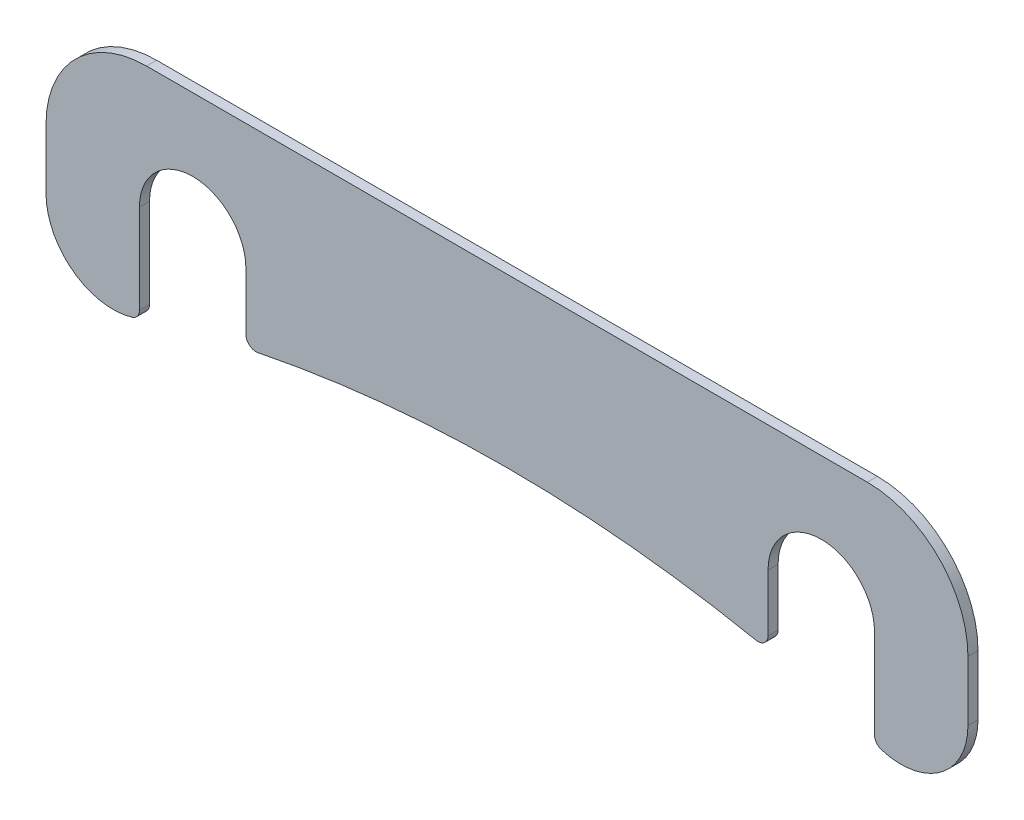
ISO-10303-21;
HEADER;
FILE_DESCRIPTION(('STEP AP214'),'2;1');
FILE_NAME('part.step','',(''),(''),'','','');
FILE_SCHEMA(('AUTOMOTIVE_DESIGN { 1 0 10303 214 1 1 1 1 }'));
ENDSEC;
DATA;
#1=APPLICATION_CONTEXT('core data for automotive mechanical design processes');
#2=APPLICATION_PROTOCOL_DEFINITION('international standard','automotive_design',2000,#1);
#3=PRODUCT_CONTEXT('',#1,'mechanical');
#4=PRODUCT('Part','Part','',(#3));
#5=PRODUCT_RELATED_PRODUCT_CATEGORY('part','',(#4));
#6=PRODUCT_DEFINITION_FORMATION('','',#4);
#7=PRODUCT_DEFINITION_CONTEXT('part definition',#1,'design');
#8=PRODUCT_DEFINITION('design','',#6,#7);
#9=PRODUCT_DEFINITION_SHAPE('','',#8);
#10=(LENGTH_UNIT() NAMED_UNIT(*) SI_UNIT(.MILLI.,.METRE.));
#11=(NAMED_UNIT(*) PLANE_ANGLE_UNIT() SI_UNIT($,.RADIAN.));
#12=(NAMED_UNIT(*) SI_UNIT($,.STERADIAN.) SOLID_ANGLE_UNIT());
#13=UNCERTAINTY_MEASURE_WITH_UNIT(LENGTH_MEASURE(1.E-05),#10,'distance_accuracy_value','');
#14=(GEOMETRIC_REPRESENTATION_CONTEXT(3) GLOBAL_UNCERTAINTY_ASSIGNED_CONTEXT((#13)) GLOBAL_UNIT_ASSIGNED_CONTEXT((#10,
#11,#12)) REPRESENTATION_CONTEXT('',''));
#15=CARTESIAN_POINT('',(0.,0.,0.));
#16=DIRECTION('',(0.,0.,1.));
#17=DIRECTION('',(1.,0.,0.));
#18=AXIS2_PLACEMENT_3D('',#15,#16,#17);
#19=CARTESIAN_POINT('',(-23.8125,0.,0.762));
#20=DIRECTION('',(0.,0.,-1.));
#21=DIRECTION('',(-1.,0.,0.));
#22=AXIS2_PLACEMENT_3D('',#19,#20,#21);
#23=CYLINDRICAL_SURFACE('',#22,4.03225);
#24=CARTESIAN_POINT('',(-23.8125,0.,0.));
#25=DIRECTION('',(0.,0.,-1.));
#26=DIRECTION('',(1.,0.,0.));
#27=AXIS2_PLACEMENT_3D('',#24,#25,#26);
#28=CIRCLE('',#27,4.03225);
#29=CARTESIAN_POINT('',(-27.84475,0.,0.));
#30=VERTEX_POINT('',#29);
#31=CARTESIAN_POINT('',(-19.78025,0.,0.));
#32=VERTEX_POINT('',#31);
#33=EDGE_CURVE('E199',#30,#32,#28,.T.);
#34=ORIENTED_EDGE('',*,*,#33,.T.);
#35=DIRECTION('',(0.,0.,-1.));
#36=VECTOR('',#35,1.);
#37=CARTESIAN_POINT('',(-19.78025,0.,0.762));
#38=LINE('',#37,#36);
#39=CARTESIAN_POINT('',(-19.78025,0.,0.762));
#40=VERTEX_POINT('',#39);
#41=EDGE_CURVE('E178',#40,#32,#38,.T.);
#42=ORIENTED_EDGE('',*,*,#41,.F.);
#43=CARTESIAN_POINT('',(-23.8125,0.,0.762));
#44=DIRECTION('',(0.,0.,-1.));
#45=DIRECTION('',(1.,0.,0.));
#46=AXIS2_PLACEMENT_3D('',#43,#44,#45);
#47=CIRCLE('',#46,4.03225);
#48=CARTESIAN_POINT('',(-27.84475,0.,0.762));
#49=VERTEX_POINT('',#48);
#50=EDGE_CURVE('E189',#49,#40,#47,.T.);
#51=ORIENTED_EDGE('',*,*,#50,.F.);
#52=DIRECTION('',(0.,0.,-1.));
#53=VECTOR('',#52,1.);
#54=CARTESIAN_POINT('',(-27.84475,0.,0.762));
#55=LINE('',#54,#53);
#56=EDGE_CURVE('E277',#49,#30,#55,.T.);
#57=ORIENTED_EDGE('',*,*,#56,.T.);
#58=EDGE_LOOP('',(#34,#42,#51,#57));
#59=FACE_BOUND('',#58,.T.);
#60=ADVANCED_FACE('F47',(#59),#23,.F.);
#61=CARTESIAN_POINT('',(-19.78025,0.,0.762));
#62=DIRECTION('',(1.,0.,0.));
#63=DIRECTION('',(0.,0.,-1.));
#64=AXIS2_PLACEMENT_3D('',#61,#62,#63);
#65=PLANE('',#64);
#66=DIRECTION('',(0.,-1.,0.));
#67=VECTOR('',#66,1.);
#68=CARTESIAN_POINT('',(-19.78025,0.,0.));
#69=LINE('',#68,#67);
#70=CARTESIAN_POINT('',(-19.78025,-4.31543454070411,0.));
#71=VERTEX_POINT('',#70);
#72=EDGE_CURVE('E359',#32,#71,#69,.T.);
#73=ORIENTED_EDGE('',*,*,#72,.T.);
#74=DIRECTION('',(0.,0.,-1.));
#75=VECTOR('',#74,1.);
#76=CARTESIAN_POINT('',(-19.78025,-4.31543454070411,0.762));
#77=LINE('',#76,#75);
#78=CARTESIAN_POINT('',(-19.78025,-4.31543454070411,0.762));
#79=VERTEX_POINT('',#78);
#80=EDGE_CURVE('E181',#71,#79,#77,.F.);
#81=ORIENTED_EDGE('',*,*,#80,.T.);
#82=DIRECTION('',(0.,-1.,0.));
#83=VECTOR('',#82,1.);
#84=CARTESIAN_POINT('',(-19.78025,0.,0.762));
#85=LINE('',#84,#83);
#86=EDGE_CURVE('E173',#40,#79,#85,.T.);
#87=ORIENTED_EDGE('',*,*,#86,.F.);
#88=ORIENTED_EDGE('',*,*,#41,.T.);
#89=EDGE_LOOP('',(#73,#81,#87,#88));
#90=FACE_BOUND('',#89,.T.);
#91=ADVANCED_FACE('F180',(#90),#65,.F.);
#92=CARTESIAN_POINT('',(0.,-98.425,0.762));
#93=DIRECTION('',(0.,0.,-1.));
#94=DIRECTION('',(-1.,0.,0.));
#95=AXIS2_PLACEMENT_3D('',#92,#93,#94);
#96=CYLINDRICAL_SURFACE('',#95,95.25);
#97=CARTESIAN_POINT('',(0.,-98.425,0.));
#98=DIRECTION('',(0.,0.,-1.));
#99=DIRECTION('',(1.,0.,0.));
#100=AXIS2_PLACEMENT_3D('',#97,#98,#99);
#101=CIRCLE('',#100,95.25);
#102=CARTESIAN_POINT('',(-18.8673115079365,-5.06233585387311,0.));
#103=VERTEX_POINT('',#102);
#104=CARTESIAN_POINT('',(18.8673115079365,-5.06233585387311,0.));
#105=VERTEX_POINT('',#104);
#106=EDGE_CURVE('E363',#103,#105,#101,.T.);
#107=ORIENTED_EDGE('',*,*,#106,.T.);
#108=DIRECTION('',(0.,0.,-1.));
#109=VECTOR('',#108,1.);
#110=CARTESIAN_POINT('',(18.8673115079365,-5.06233585387311,0.762));
#111=LINE('',#110,#109);
#112=CARTESIAN_POINT('',(18.8673115079365,-5.06233585387311,0.762));
#113=VERTEX_POINT('',#112);
#114=EDGE_CURVE('E247',#105,#113,#111,.F.);
#115=ORIENTED_EDGE('',*,*,#114,.T.);
#116=CARTESIAN_POINT('',(0.,-98.425,0.762));
#117=DIRECTION('',(0.,0.,-1.));
#118=DIRECTION('',(1.,0.,0.));
#119=AXIS2_PLACEMENT_3D('',#116,#117,#118);
#120=CIRCLE('',#119,95.25);
#121=CARTESIAN_POINT('',(-18.8673115079365,-5.06233585387311,0.762));
#122=VERTEX_POINT('',#121);
#123=EDGE_CURVE('E187',#122,#113,#120,.T.);
#124=ORIENTED_EDGE('',*,*,#123,.F.);
#125=DIRECTION('',(0.,0.,-1.));
#126=VECTOR('',#125,1.);
#127=CARTESIAN_POINT('',(-18.8673115079365,-5.06233585387311,0.762));
#128=LINE('',#127,#126);
#129=EDGE_CURVE('E248',#122,#103,#128,.T.);
#130=ORIENTED_EDGE('',*,*,#129,.T.);
#131=EDGE_LOOP('',(#107,#115,#124,#130));
#132=FACE_BOUND('',#131,.T.);
#133=ADVANCED_FACE('F433',(#132),#96,.F.);
#134=CARTESIAN_POINT('',(19.78025,0.,0.762));
#135=DIRECTION('',(-1.,0.,0.));
#136=DIRECTION('',(0.,-1.,0.));
#137=AXIS2_PLACEMENT_3D('',#134,#135,#136);
#138=PLANE('',#137);
#139=DIRECTION('',(0.,1.,0.));
#140=VECTOR('',#139,1.);
#141=CARTESIAN_POINT('',(19.78025,0.,0.762));
#142=LINE('',#141,#140);
#143=CARTESIAN_POINT('',(19.78025,-4.31543454070413,0.762));
#144=VERTEX_POINT('',#143);
#145=CARTESIAN_POINT('',(19.78025,0.,0.762));
#146=VERTEX_POINT('',#145);
#147=EDGE_CURVE('E372',#144,#146,#142,.T.);
#148=ORIENTED_EDGE('',*,*,#147,.F.);
#149=DIRECTION('',(0.,0.,-1.));
#150=VECTOR('',#149,1.);
#151=CARTESIAN_POINT('',(19.78025,-4.31543454070413,0.762));
#152=LINE('',#151,#150);
#153=CARTESIAN_POINT('',(19.78025,-4.31543454070413,0.));
#154=VERTEX_POINT('',#153);
#155=EDGE_CURVE('E244',#144,#154,#152,.T.);
#156=ORIENTED_EDGE('',*,*,#155,.T.);
#157=DIRECTION('',(0.,1.,0.));
#158=VECTOR('',#157,1.);
#159=CARTESIAN_POINT('',(19.78025,0.,0.));
#160=LINE('',#159,#158);
#161=CARTESIAN_POINT('',(19.78025,0.,0.));
#162=VERTEX_POINT('',#161);
#163=EDGE_CURVE('E323',#154,#162,#160,.T.);
#164=ORIENTED_EDGE('',*,*,#163,.T.);
#165=DIRECTION('',(0.,0.,-1.));
#166=VECTOR('',#165,1.);
#167=CARTESIAN_POINT('',(19.78025,0.,0.762));
#168=LINE('',#167,#166);
#169=EDGE_CURVE('E201',#146,#162,#168,.T.);
#170=ORIENTED_EDGE('',*,*,#169,.F.);
#171=EDGE_LOOP('',(#148,#156,#164,#170));
#172=FACE_BOUND('',#171,.T.);
#173=ADVANCED_FACE('F369',(#172),#138,.F.);
#174=CARTESIAN_POINT('',(23.8125,0.,0.762));
#175=DIRECTION('',(0.,0.,-1.));
#176=DIRECTION('',(-1.,0.,0.));
#177=AXIS2_PLACEMENT_3D('',#174,#175,#176);
#178=CYLINDRICAL_SURFACE('',#177,4.03225);
#179=CARTESIAN_POINT('',(23.8125,0.,0.));
#180=DIRECTION('',(0.,0.,-1.));
#181=DIRECTION('',(1.,0.,0.));
#182=AXIS2_PLACEMENT_3D('',#179,#180,#181);
#183=CIRCLE('',#182,4.03225);
#184=CARTESIAN_POINT('',(27.84475,0.,0.));
#185=VERTEX_POINT('',#184);
#186=EDGE_CURVE('E312',#162,#185,#183,.T.);
#187=ORIENTED_EDGE('',*,*,#186,.T.);
#188=DIRECTION('',(0.,0.,-1.));
#189=VECTOR('',#188,1.);
#190=CARTESIAN_POINT('',(27.84475,0.,0.762));
#191=LINE('',#190,#189);
#192=CARTESIAN_POINT('',(27.84475,0.,0.762));
#193=VERTEX_POINT('',#192);
#194=EDGE_CURVE('E213',#193,#185,#191,.T.);
#195=ORIENTED_EDGE('',*,*,#194,.F.);
#196=CARTESIAN_POINT('',(23.8125,0.,0.762));
#197=DIRECTION('',(0.,0.,-1.));
#198=DIRECTION('',(1.,0.,0.));
#199=AXIS2_PLACEMENT_3D('',#196,#197,#198);
#200=CIRCLE('',#199,4.03225);
#201=EDGE_CURVE('E375',#146,#193,#200,.T.);
#202=ORIENTED_EDGE('',*,*,#201,.F.);
#203=ORIENTED_EDGE('',*,*,#169,.T.);
#204=EDGE_LOOP('',(#187,#195,#202,#203));
#205=FACE_BOUND('',#204,.T.);
#206=ADVANCED_FACE('F371',(#205),#178,.F.);
#207=CARTESIAN_POINT('',(27.84475,0.,0.762));
#208=DIRECTION('',(1.,0.,0.));
#209=DIRECTION('',(0.,1.,0.));
#210=AXIS2_PLACEMENT_3D('',#207,#208,#209);
#211=PLANE('',#210);
#212=DIRECTION('',(0.,-1.,0.));
#213=VECTOR('',#212,1.);
#214=CARTESIAN_POINT('',(27.84475,0.,0.));
#215=LINE('',#214,#213);
#216=CARTESIAN_POINT('',(27.84475,-6.77341920168427,0.));
#217=VERTEX_POINT('',#216);
#218=EDGE_CURVE('E306',#185,#217,#215,.T.);
#219=ORIENTED_EDGE('',*,*,#218,.T.);
#220=DIRECTION('',(0.,0.,-1.));
#221=VECTOR('',#220,1.);
#222=CARTESIAN_POINT('',(27.84475,-6.77341920168427,0.762));
#223=LINE('',#222,#221);
#224=CARTESIAN_POINT('',(27.84475,-6.77341920168427,0.762));
#225=VERTEX_POINT('',#224);
#226=EDGE_CURVE('E230',#217,#225,#223,.F.);
#227=ORIENTED_EDGE('',*,*,#226,.T.);
#228=DIRECTION('',(0.,-1.,0.));
#229=VECTOR('',#228,1.);
#230=CARTESIAN_POINT('',(27.84475,0.,0.762));
#231=LINE('',#230,#229);
#232=EDGE_CURVE('E309',#193,#225,#231,.T.);
#233=ORIENTED_EDGE('',*,*,#232,.F.);
#234=ORIENTED_EDGE('',*,*,#194,.T.);
#235=EDGE_LOOP('',(#219,#227,#233,#234));
#236=FACE_BOUND('',#235,.T.);
#237=ADVANCED_FACE('F307',(#236),#211,.F.);
#238=CARTESIAN_POINT('',(29.845,-2.63677068658174,0.762));
#239=DIRECTION('',(0.,0.,-1.));
#240=DIRECTION('',(-1.,0.,0.));
#241=AXIS2_PLACEMENT_3D('',#238,#239,#240);
#242=CYLINDRICAL_SURFACE('',#241,5.08);
#243=CARTESIAN_POINT('',(29.845,-2.63677068658174,0.762));
#244=DIRECTION('',(0.,0.,1.));
#245=DIRECTION('',(1.,0.,0.));
#246=AXIS2_PLACEMENT_3D('',#243,#244,#245);
#247=CIRCLE('',#246,5.08);
#248=CARTESIAN_POINT('',(28.3882352941176,-7.50341599846707,0.762));
#249=VERTEX_POINT('',#248);
#250=CARTESIAN_POINT('',(34.925,-2.63677068658174,0.762));
#251=VERTEX_POINT('',#250);
#252=EDGE_CURVE('E376',#249,#251,#247,.T.);
#253=ORIENTED_EDGE('',*,*,#252,.F.);
#254=DIRECTION('',(0.,0.,-1.));
#255=VECTOR('',#254,1.);
#256=CARTESIAN_POINT('',(28.3882352941176,-7.50341599846707,0.762));
#257=LINE('',#256,#255);
#258=CARTESIAN_POINT('',(28.3882352941176,-7.50341599846707,0.));
#259=VERTEX_POINT('',#258);
#260=EDGE_CURVE('E205',#249,#259,#257,.T.);
#261=ORIENTED_EDGE('',*,*,#260,.T.);
#262=CARTESIAN_POINT('',(29.845,-2.63677068658174,0.));
#263=DIRECTION('',(0.,0.,1.));
#264=DIRECTION('',(1.,0.,0.));
#265=AXIS2_PLACEMENT_3D('',#262,#263,#264);
#266=CIRCLE('',#265,5.08);
#267=CARTESIAN_POINT('',(34.925,-2.63677068658174,0.));
#268=VERTEX_POINT('',#267);
#269=EDGE_CURVE('E320',#259,#268,#266,.T.);
#270=ORIENTED_EDGE('',*,*,#269,.T.);
#271=DIRECTION('',(0.,0.,-1.));
#272=VECTOR('',#271,1.);
#273=CARTESIAN_POINT('',(34.925,-2.63677068658174,0.762));
#274=LINE('',#273,#272);
#275=EDGE_CURVE('E297',#251,#268,#274,.T.);
#276=ORIENTED_EDGE('',*,*,#275,.F.);
#277=EDGE_LOOP('',(#253,#261,#270,#276));
#278=FACE_BOUND('',#277,.T.);
#279=ADVANCED_FACE('F415',(#278),#242,.T.);
#280=CARTESIAN_POINT('',(34.925,1.90499999999995,0.762));
#281=DIRECTION('',(-1.,0.,0.));
#282=DIRECTION('',(0.,0.,1.));
#283=AXIS2_PLACEMENT_3D('',#280,#281,#282);
#284=PLANE('',#283);
#285=DIRECTION('',(0.,1.,0.));
#286=VECTOR('',#285,1.);
#287=CARTESIAN_POINT('',(34.925,1.90499999999995,0.));
#288=LINE('',#287,#286);
#289=CARTESIAN_POINT('',(34.925,1.90499999999995,0.));
#290=VERTEX_POINT('',#289);
#291=EDGE_CURVE('E319',#268,#290,#288,.T.);
#292=ORIENTED_EDGE('',*,*,#291,.T.);
#293=DIRECTION('',(0.,0.,-1.));
#294=VECTOR('',#293,1.);
#295=CARTESIAN_POINT('',(34.925,1.90499999999995,0.762));
#296=LINE('',#295,#294);
#297=CARTESIAN_POINT('',(34.925,1.90499999999995,0.762));
#298=VERTEX_POINT('',#297);
#299=EDGE_CURVE('E291',#298,#290,#296,.T.);
#300=ORIENTED_EDGE('',*,*,#299,.F.);
#301=DIRECTION('',(0.,1.,0.));
#302=VECTOR('',#301,1.);
#303=CARTESIAN_POINT('',(34.925,1.90499999999995,0.762));
#304=LINE('',#303,#302);
#305=EDGE_CURVE('E382',#251,#298,#304,.T.);
#306=ORIENTED_EDGE('',*,*,#305,.F.);
#307=ORIENTED_EDGE('',*,*,#275,.T.);
#308=EDGE_LOOP('',(#292,#300,#306,#307));
#309=FACE_BOUND('',#308,.T.);
#310=ADVANCED_FACE('F410',(#309),#284,.F.);
#311=CARTESIAN_POINT('',(27.305,1.905,0.762));
#312=DIRECTION('',(0.,0.,-1.));
#313=DIRECTION('',(-1.,0.,0.));
#314=AXIS2_PLACEMENT_3D('',#311,#312,#313);
#315=CYLINDRICAL_SURFACE('',#314,7.62);
#316=CARTESIAN_POINT('',(27.305,1.905,0.));
#317=DIRECTION('',(0.,0.,1.));
#318=DIRECTION('',(-1.,0.,0.));
#319=AXIS2_PLACEMENT_3D('',#316,#317,#318);
#320=CIRCLE('',#319,7.62);
#321=CARTESIAN_POINT('',(27.3049999999999,9.525,0.));
#322=VERTEX_POINT('',#321);
#323=EDGE_CURVE('E328',#290,#322,#320,.T.);
#324=ORIENTED_EDGE('',*,*,#323,.T.);
#325=DIRECTION('',(0.,0.,-1.));
#326=VECTOR('',#325,1.);
#327=CARTESIAN_POINT('',(27.3049999999999,9.525,0.762));
#328=LINE('',#327,#326);
#329=CARTESIAN_POINT('',(27.3049999999999,9.525,0.762));
#330=VERTEX_POINT('',#329);
#331=EDGE_CURVE('E286',#330,#322,#328,.T.);
#332=ORIENTED_EDGE('',*,*,#331,.F.);
#333=CARTESIAN_POINT('',(27.305,1.905,0.762));
#334=DIRECTION('',(0.,0.,1.));
#335=DIRECTION('',(-1.,0.,0.));
#336=AXIS2_PLACEMENT_3D('',#333,#334,#335);
#337=CIRCLE('',#336,7.62);
#338=EDGE_CURVE('E387',#298,#330,#337,.T.);
#339=ORIENTED_EDGE('',*,*,#338,.F.);
#340=ORIENTED_EDGE('',*,*,#299,.T.);
#341=EDGE_LOOP('',(#324,#332,#339,#340));
#342=FACE_BOUND('',#341,.T.);
#343=ADVANCED_FACE('F404',(#342),#315,.T.);
#344=CARTESIAN_POINT('',(-27.3049999999999,9.525,0.762));
#345=DIRECTION('',(0.,-1.,0.));
#346=DIRECTION('',(0.,0.,-1.));
#347=AXIS2_PLACEMENT_3D('',#344,#345,#346);
#348=PLANE('',#347);
#349=DIRECTION('',(-1.,0.,0.));
#350=VECTOR('',#349,1.);
#351=CARTESIAN_POINT('',(-27.3049999999999,9.525,0.));
#352=LINE('',#351,#350);
#353=CARTESIAN_POINT('',(-27.3049999999999,9.525,0.));
#354=VERTEX_POINT('',#353);
#355=EDGE_CURVE('E335',#322,#354,#352,.T.);
#356=ORIENTED_EDGE('',*,*,#355,.T.);
#357=DIRECTION('',(0.,0.,-1.));
#358=VECTOR('',#357,1.);
#359=CARTESIAN_POINT('',(-27.3049999999999,9.525,0.762));
#360=LINE('',#359,#358);
#361=CARTESIAN_POINT('',(-27.3049999999999,9.525,0.762));
#362=VERTEX_POINT('',#361);
#363=EDGE_CURVE('E283',#362,#354,#360,.T.);
#364=ORIENTED_EDGE('',*,*,#363,.F.);
#365=DIRECTION('',(-1.,0.,0.));
#366=VECTOR('',#365,1.);
#367=CARTESIAN_POINT('',(-27.3049999999999,9.525,0.762));
#368=LINE('',#367,#366);
#369=EDGE_CURVE('E389',#330,#362,#368,.T.);
#370=ORIENTED_EDGE('',*,*,#369,.F.);
#371=ORIENTED_EDGE('',*,*,#331,.T.);
#372=EDGE_LOOP('',(#356,#364,#370,#371));
#373=FACE_BOUND('',#372,.T.);
#374=ADVANCED_FACE('F398',(#373),#348,.F.);
#375=CARTESIAN_POINT('',(-27.305,1.905,0.762));
#376=DIRECTION('',(0.,0.,-1.));
#377=DIRECTION('',(-1.,0.,0.));
#378=AXIS2_PLACEMENT_3D('',#375,#376,#377);
#379=CYLINDRICAL_SURFACE('',#378,7.62);
#380=CARTESIAN_POINT('',(-27.305,1.905,0.));
#381=DIRECTION('',(0.,0.,1.));
#382=DIRECTION('',(1.,0.,0.));
#383=AXIS2_PLACEMENT_3D('',#380,#381,#382);
#384=CIRCLE('',#383,7.62);
#385=CARTESIAN_POINT('',(-34.925,1.90499999999995,0.));
#386=VERTEX_POINT('',#385);
#387=EDGE_CURVE('E333',#354,#386,#384,.T.);
#388=ORIENTED_EDGE('',*,*,#387,.T.);
#389=DIRECTION('',(0.,0.,-1.));
#390=VECTOR('',#389,1.);
#391=CARTESIAN_POINT('',(-34.925,1.90499999999995,0.762));
#392=LINE('',#391,#390);
#393=CARTESIAN_POINT('',(-34.925,1.90499999999995,0.762));
#394=VERTEX_POINT('',#393);
#395=EDGE_CURVE('E282',#394,#386,#392,.T.);
#396=ORIENTED_EDGE('',*,*,#395,.F.);
#397=CARTESIAN_POINT('',(-27.305,1.905,0.762));
#398=DIRECTION('',(0.,0.,1.));
#399=DIRECTION('',(1.,0.,0.));
#400=AXIS2_PLACEMENT_3D('',#397,#398,#399);
#401=CIRCLE('',#400,7.62);
#402=EDGE_CURVE('E351',#362,#394,#401,.T.);
#403=ORIENTED_EDGE('',*,*,#402,.F.);
#404=ORIENTED_EDGE('',*,*,#363,.T.);
#405=EDGE_LOOP('',(#388,#396,#403,#404));
#406=FACE_BOUND('',#405,.T.);
#407=ADVANCED_FACE('F393',(#406),#379,.T.);
#408=CARTESIAN_POINT('',(-34.925,1.90499999999995,0.762));
#409=DIRECTION('',(1.,0.,0.));
#410=DIRECTION('',(0.,0.,-1.));
#411=AXIS2_PLACEMENT_3D('',#408,#409,#410);
#412=PLANE('',#411);
#413=DIRECTION('',(0.,-1.,0.));
#414=VECTOR('',#413,1.);
#415=CARTESIAN_POINT('',(-34.925,1.90499999999995,0.));
#416=LINE('',#415,#414);
#417=CARTESIAN_POINT('',(-34.925,-2.63677068658174,0.));
#418=VERTEX_POINT('',#417);
#419=EDGE_CURVE('E275',#386,#418,#416,.T.);
#420=ORIENTED_EDGE('',*,*,#419,.T.);
#421=DIRECTION('',(0.,0.,-1.));
#422=VECTOR('',#421,1.);
#423=CARTESIAN_POINT('',(-34.925,-2.63677068658174,0.762));
#424=LINE('',#423,#422);
#425=CARTESIAN_POINT('',(-34.925,-2.63677068658174,0.762));
#426=VERTEX_POINT('',#425);
#427=EDGE_CURVE('E279',#426,#418,#424,.T.);
#428=ORIENTED_EDGE('',*,*,#427,.F.);
#429=DIRECTION('',(0.,-1.,0.));
#430=VECTOR('',#429,1.);
#431=CARTESIAN_POINT('',(-34.925,1.90499999999995,0.762));
#432=LINE('',#431,#430);
#433=EDGE_CURVE('E346',#394,#426,#432,.T.);
#434=ORIENTED_EDGE('',*,*,#433,.F.);
#435=ORIENTED_EDGE('',*,*,#395,.T.);
#436=EDGE_LOOP('',(#420,#428,#434,#435));
#437=FACE_BOUND('',#436,.T.);
#438=ADVANCED_FACE('F342',(#437),#412,.F.);
#439=CARTESIAN_POINT('',(-29.845,-2.63677068658174,0.762));
#440=DIRECTION('',(0.,0.,-1.));
#441=DIRECTION('',(-1.,0.,0.));
#442=AXIS2_PLACEMENT_3D('',#439,#440,#441);
#443=CYLINDRICAL_SURFACE('',#442,5.08);
#444=CARTESIAN_POINT('',(-29.845,-2.63677068658174,0.));
#445=DIRECTION('',(0.,0.,1.));
#446=DIRECTION('',(1.,0.,0.));
#447=AXIS2_PLACEMENT_3D('',#444,#445,#446);
#448=CIRCLE('',#447,5.08);
#449=CARTESIAN_POINT('',(-28.3882352941176,-7.50341599846708,0.));
#450=VERTEX_POINT('',#449);
#451=EDGE_CURVE('E270',#418,#450,#448,.T.);
#452=ORIENTED_EDGE('',*,*,#451,.T.);
#453=DIRECTION('',(0.,0.,-1.));
#454=VECTOR('',#453,1.);
#455=CARTESIAN_POINT('',(-28.3882352941176,-7.50341599846708,0.762));
#456=LINE('',#455,#454);
#457=CARTESIAN_POINT('',(-28.3882352941176,-7.50341599846708,0.762));
#458=VERTEX_POINT('',#457);
#459=EDGE_CURVE('E11',#450,#458,#456,.F.);
#460=ORIENTED_EDGE('',*,*,#459,.T.);
#461=CARTESIAN_POINT('',(-29.845,-2.63677068658174,0.762));
#462=DIRECTION('',(0.,0.,1.));
#463=DIRECTION('',(1.,0.,0.));
#464=AXIS2_PLACEMENT_3D('',#461,#462,#463);
#465=CIRCLE('',#464,5.08);
#466=EDGE_CURVE('E347',#426,#458,#465,.T.);
#467=ORIENTED_EDGE('',*,*,#466,.F.);
#468=ORIENTED_EDGE('',*,*,#427,.T.);
#469=EDGE_LOOP('',(#452,#460,#467,#468));
#470=FACE_BOUND('',#469,.T.);
#471=ADVANCED_FACE('F343',(#470),#443,.T.);
#472=CARTESIAN_POINT('',(-27.84475,0.,0.762));
#473=DIRECTION('',(-1.,0.,0.));
#474=DIRECTION('',(0.,0.,1.));
#475=AXIS2_PLACEMENT_3D('',#472,#473,#474);
#476=PLANE('',#475);
#477=DIRECTION('',(0.,1.,0.));
#478=VECTOR('',#477,1.);
#479=CARTESIAN_POINT('',(-27.84475,0.,0.762));
#480=LINE('',#479,#478);
#481=CARTESIAN_POINT('',(-27.84475,-6.77341920168427,0.762));
#482=VERTEX_POINT('',#481);
#483=EDGE_CURVE('E195',#482,#49,#480,.T.);
#484=ORIENTED_EDGE('',*,*,#483,.F.);
#485=DIRECTION('',(0.,0.,-1.));
#486=VECTOR('',#485,1.);
#487=CARTESIAN_POINT('',(-27.84475,-6.77341920168427,0.762));
#488=LINE('',#487,#486);
#489=CARTESIAN_POINT('',(-27.84475,-6.77341920168427,0.));
#490=VERTEX_POINT('',#489);
#491=EDGE_CURVE('E59',#482,#490,#488,.T.);
#492=ORIENTED_EDGE('',*,*,#491,.T.);
#493=DIRECTION('',(0.,1.,0.));
#494=VECTOR('',#493,1.);
#495=CARTESIAN_POINT('',(-27.84475,0.,0.));
#496=LINE('',#495,#494);
#497=EDGE_CURVE('E197',#490,#30,#496,.T.);
#498=ORIENTED_EDGE('',*,*,#497,.T.);
#499=ORIENTED_EDGE('',*,*,#56,.F.);
#500=EDGE_LOOP('',(#484,#492,#498,#499));
#501=FACE_BOUND('',#500,.T.);
#502=ADVANCED_FACE('F257',(#501),#476,.F.);
#503=CARTESIAN_POINT('',(-23.8125,0.,0.762));
#504=DIRECTION('',(0.,0.,1.));
#505=DIRECTION('',(1.,0.,0.));
#506=AXIS2_PLACEMENT_3D('',#503,#504,#505);
#507=PLANE('',#506);
#508=ORIENTED_EDGE('',*,*,#232,.T.);
#509=CARTESIAN_POINT('',(28.60675,-6.77341920168427,0.762));
#510=DIRECTION('',(0.,0.,1.));
#511=DIRECTION('',(1.,0.,0.));
#512=AXIS2_PLACEMENT_3D('',#509,#510,#511);
#513=CIRCLE('',#512,0.762);
#514=EDGE_CURVE('E239',#225,#249,#513,.T.);
#515=ORIENTED_EDGE('',*,*,#514,.T.);
#516=ORIENTED_EDGE('',*,*,#252,.T.);
#517=ORIENTED_EDGE('',*,*,#305,.T.);
#518=ORIENTED_EDGE('',*,*,#338,.T.);
#519=ORIENTED_EDGE('',*,*,#369,.T.);
#520=ORIENTED_EDGE('',*,*,#402,.T.);
#521=ORIENTED_EDGE('',*,*,#433,.T.);
#522=ORIENTED_EDGE('',*,*,#466,.T.);
#523=CARTESIAN_POINT('',(-28.60675,-6.77341920168427,0.762));
#524=DIRECTION('',(0.,0.,1.));
#525=DIRECTION('',(1.,0.,0.));
#526=AXIS2_PLACEMENT_3D('',#523,#524,#525);
#527=CIRCLE('',#526,0.762);
#528=EDGE_CURVE('E63',#458,#482,#527,.T.);
#529=ORIENTED_EDGE('',*,*,#528,.T.);
#530=ORIENTED_EDGE('',*,*,#483,.T.);
#531=ORIENTED_EDGE('',*,*,#50,.T.);
#532=ORIENTED_EDGE('',*,*,#86,.T.);
#533=CARTESIAN_POINT('',(-19.01825,-4.31543454070411,0.762));
#534=DIRECTION('',(0.,0.,1.));
#535=DIRECTION('',(1.,0.,0.));
#536=AXIS2_PLACEMENT_3D('',#533,#534,#535);
#537=CIRCLE('',#536,0.762);
#538=EDGE_CURVE('E235',#79,#122,#537,.T.);
#539=ORIENTED_EDGE('',*,*,#538,.T.);
#540=ORIENTED_EDGE('',*,*,#123,.T.);
#541=CARTESIAN_POINT('',(19.01825,-4.31543454070413,0.762));
#542=DIRECTION('',(0.,0.,1.));
#543=DIRECTION('',(1.,0.,0.));
#544=AXIS2_PLACEMENT_3D('',#541,#542,#543);
#545=CIRCLE('',#544,0.762);
#546=EDGE_CURVE('E237',#113,#144,#545,.T.);
#547=ORIENTED_EDGE('',*,*,#546,.T.);
#548=ORIENTED_EDGE('',*,*,#147,.T.);
#549=ORIENTED_EDGE('',*,*,#201,.T.);
#550=EDGE_LOOP('',(#508,#515,#516,#517,#518,#519,#520,#521,#522,#529,#530,#531,#532,#539,#540,
#547,#548,#549));
#551=FACE_BOUND('',#550,.T.);
#552=ADVANCED_FACE('F193',(#551),#507,.T.);
#553=CARTESIAN_POINT('',(-23.8125,0.,0.));
#554=DIRECTION('',(0.,0.,1.));
#555=DIRECTION('',(1.,0.,0.));
#556=AXIS2_PLACEMENT_3D('',#553,#554,#555);
#557=PLANE('',#556);
#558=ORIENTED_EDGE('',*,*,#269,.F.);
#559=CARTESIAN_POINT('',(28.60675,-6.77341920168427,0.));
#560=DIRECTION('',(0.,0.,1.));
#561=DIRECTION('',(1.,0.,0.));
#562=AXIS2_PLACEMENT_3D('',#559,#560,#561);
#563=CIRCLE('',#562,0.762);
#564=EDGE_CURVE('E223',#259,#217,#563,.F.);
#565=ORIENTED_EDGE('',*,*,#564,.T.);
#566=ORIENTED_EDGE('',*,*,#218,.F.);
#567=ORIENTED_EDGE('',*,*,#186,.F.);
#568=ORIENTED_EDGE('',*,*,#163,.F.);
#569=CARTESIAN_POINT('',(19.01825,-4.31543454070413,0.));
#570=DIRECTION('',(0.,0.,1.));
#571=DIRECTION('',(1.,0.,0.));
#572=AXIS2_PLACEMENT_3D('',#569,#570,#571);
#573=CIRCLE('',#572,0.762);
#574=EDGE_CURVE('E225',#154,#105,#573,.F.);
#575=ORIENTED_EDGE('',*,*,#574,.T.);
#576=ORIENTED_EDGE('',*,*,#106,.F.);
#577=CARTESIAN_POINT('',(-19.01825,-4.31543454070411,0.));
#578=DIRECTION('',(0.,0.,1.));
#579=DIRECTION('',(1.,0.,0.));
#580=AXIS2_PLACEMENT_3D('',#577,#578,#579);
#581=CIRCLE('',#580,0.762);
#582=EDGE_CURVE('E218',#103,#71,#581,.F.);
#583=ORIENTED_EDGE('',*,*,#582,.T.);
#584=ORIENTED_EDGE('',*,*,#72,.F.);
#585=ORIENTED_EDGE('',*,*,#33,.F.);
#586=ORIENTED_EDGE('',*,*,#497,.F.);
#587=CARTESIAN_POINT('',(-28.60675,-6.77341920168427,0.));
#588=DIRECTION('',(0.,0.,1.));
#589=DIRECTION('',(1.,0.,0.));
#590=AXIS2_PLACEMENT_3D('',#587,#588,#589);
#591=CIRCLE('',#590,0.762);
#592=EDGE_CURVE('E207',#490,#450,#591,.F.);
#593=ORIENTED_EDGE('',*,*,#592,.T.);
#594=ORIENTED_EDGE('',*,*,#451,.F.);
#595=ORIENTED_EDGE('',*,*,#419,.F.);
#596=ORIENTED_EDGE('',*,*,#387,.F.);
#597=ORIENTED_EDGE('',*,*,#355,.F.);
#598=ORIENTED_EDGE('',*,*,#323,.F.);
#599=ORIENTED_EDGE('',*,*,#291,.F.);
#600=EDGE_LOOP('',(#558,#565,#566,#567,#568,#575,#576,#583,#584,#585,#586,#593,#594,#595,#596,
#597,#598,#599));
#601=FACE_BOUND('',#600,.T.);
#602=ADVANCED_FACE('F262',(#601),#557,.F.);
#603=CARTESIAN_POINT('',(28.60675,-6.77341920168427,0.762));
#604=DIRECTION('',(0.,0.,-1.));
#605=DIRECTION('',(-1.,0.,0.));
#606=AXIS2_PLACEMENT_3D('',#603,#604,#605);
#607=CYLINDRICAL_SURFACE('',#606,0.762);
#608=ORIENTED_EDGE('',*,*,#514,.F.);
#609=ORIENTED_EDGE('',*,*,#226,.F.);
#610=ORIENTED_EDGE('',*,*,#564,.F.);
#611=ORIENTED_EDGE('',*,*,#260,.F.);
#612=EDGE_LOOP('',(#608,#609,#610,#611));
#613=FACE_BOUND('',#612,.T.);
#614=ADVANCED_FACE('F418',(#613),#607,.T.);
#615=CARTESIAN_POINT('',(19.01825,-4.31543454070413,0.762));
#616=DIRECTION('',(0.,0.,-1.));
#617=DIRECTION('',(-1.,0.,0.));
#618=AXIS2_PLACEMENT_3D('',#615,#616,#617);
#619=CYLINDRICAL_SURFACE('',#618,0.762);
#620=ORIENTED_EDGE('',*,*,#546,.F.);
#621=ORIENTED_EDGE('',*,*,#114,.F.);
#622=ORIENTED_EDGE('',*,*,#574,.F.);
#623=ORIENTED_EDGE('',*,*,#155,.F.);
#624=EDGE_LOOP('',(#620,#621,#622,#623));
#625=FACE_BOUND('',#624,.T.);
#626=ADVANCED_FACE('F416',(#625),#619,.T.);
#627=CARTESIAN_POINT('',(-19.01825,-4.31543454070411,0.762));
#628=DIRECTION('',(0.,0.,-1.));
#629=DIRECTION('',(-1.,0.,0.));
#630=AXIS2_PLACEMENT_3D('',#627,#628,#629);
#631=CYLINDRICAL_SURFACE('',#630,0.762);
#632=ORIENTED_EDGE('',*,*,#538,.F.);
#633=ORIENTED_EDGE('',*,*,#80,.F.);
#634=ORIENTED_EDGE('',*,*,#582,.F.);
#635=ORIENTED_EDGE('',*,*,#129,.F.);
#636=EDGE_LOOP('',(#632,#633,#634,#635));
#637=FACE_BOUND('',#636,.T.);
#638=ADVANCED_FACE('F424',(#637),#631,.T.);
#639=CARTESIAN_POINT('',(-28.60675,-6.77341920168427,0.762));
#640=DIRECTION('',(0.,0.,-1.));
#641=DIRECTION('',(-1.,0.,0.));
#642=AXIS2_PLACEMENT_3D('',#639,#640,#641);
#643=CYLINDRICAL_SURFACE('',#642,0.762);
#644=ORIENTED_EDGE('',*,*,#528,.F.);
#645=ORIENTED_EDGE('',*,*,#459,.F.);
#646=ORIENTED_EDGE('',*,*,#592,.F.);
#647=ORIENTED_EDGE('',*,*,#491,.F.);
#648=EDGE_LOOP('',(#644,#645,#646,#647));
#649=FACE_BOUND('',#648,.T.);
#650=ADVANCED_FACE('F51',(#649),#643,.T.);
#651=CLOSED_SHELL('',(#60,#91,#133,#173,#206,#237,#279,#310,#343,#374,#407,#438,#471,#502,#552,
#602,#614,#626,#638,#650));
#652=MANIFOLD_SOLID_BREP('B2',#651);
#653=ADVANCED_BREP_SHAPE_REPRESENTATION('',(#18,#652),#14);
#654=SHAPE_DEFINITION_REPRESENTATION(#9,#653);
ENDSEC;
END-ISO-10303-21;
